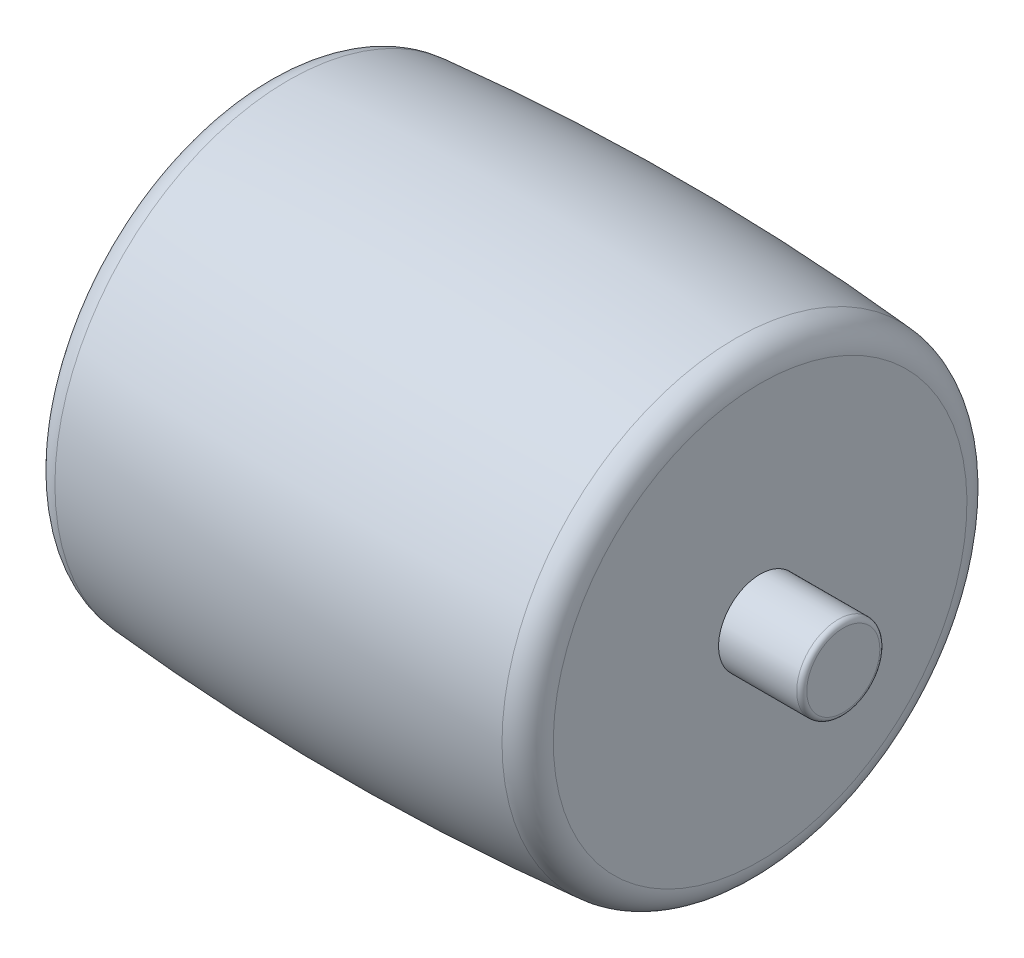
ISO-10303-21;
HEADER;
FILE_DESCRIPTION(('STEP AP214'),'2;1');
FILE_NAME('part.step','',(''),(''),'','','');
FILE_SCHEMA(('AUTOMOTIVE_DESIGN { 1 0 10303 214 1 1 1 1 }'));
ENDSEC;
DATA;
#1=APPLICATION_CONTEXT('core data for automotive mechanical design processes');
#2=APPLICATION_PROTOCOL_DEFINITION('international standard','automotive_design',2000,#1);
#3=PRODUCT_CONTEXT('',#1,'mechanical');
#4=PRODUCT('Part','Part','',(#3));
#5=PRODUCT_RELATED_PRODUCT_CATEGORY('part','',(#4));
#6=PRODUCT_DEFINITION_FORMATION('','',#4);
#7=PRODUCT_DEFINITION_CONTEXT('part definition',#1,'design');
#8=PRODUCT_DEFINITION('design','',#6,#7);
#9=PRODUCT_DEFINITION_SHAPE('','',#8);
#10=(LENGTH_UNIT() NAMED_UNIT(*) SI_UNIT(.MILLI.,.METRE.));
#11=(NAMED_UNIT(*) PLANE_ANGLE_UNIT() SI_UNIT($,.RADIAN.));
#12=(NAMED_UNIT(*) SI_UNIT($,.STERADIAN.) SOLID_ANGLE_UNIT());
#13=UNCERTAINTY_MEASURE_WITH_UNIT(LENGTH_MEASURE(1.E-05),#10,'distance_accuracy_value','');
#14=(GEOMETRIC_REPRESENTATION_CONTEXT(3) GLOBAL_UNCERTAINTY_ASSIGNED_CONTEXT((#13)) GLOBAL_UNIT_ASSIGNED_CONTEXT((#10,
#11,#12)) REPRESENTATION_CONTEXT('',''));
#15=CARTESIAN_POINT('',(0.,0.,0.));
#16=DIRECTION('',(0.,0.,1.));
#17=DIRECTION('',(1.,0.,0.));
#18=AXIS2_PLACEMENT_3D('',#15,#16,#17);
#19=CARTESIAN_POINT('',(-17.3212522416021,-0.85375137830538,0.));
#20=DIRECTION('',(1.,0.,0.));
#21=DIRECTION('',(0.,0.,-1.));
#22=AXIS2_PLACEMENT_3D('',#19,#20,#21);
#23=PLANE('',#22);
#24=CARTESIAN_POINT('',(-17.3212522416022,-0.85375137830538,0.));
#25=DIRECTION('',(1.,0.,0.));
#26=DIRECTION('',(0.,0.,1.));
#27=AXIS2_PLACEMENT_3D('',#24,#25,#26);
#28=CIRCLE('',#27,1.3843);
#29=CARTESIAN_POINT('',(-17.3212522416022,-0.85375137830538,1.3843));
#30=VERTEX_POINT('',#29);
#31=EDGE_CURVE('E140',#30,#30,#28,.T.);
#32=ORIENTED_EDGE('',*,*,#31,.F.);
#33=EDGE_LOOP('',(#32));
#34=FACE_BOUND('',#33,.T.);
#35=ADVANCED_FACE('F15',(#34),#23,.F.);
#36=CARTESIAN_POINT('',(7.77394775839785,-0.85375137830538,0.));
#37=DIRECTION('',(1.,0.,0.));
#38=DIRECTION('',(0.,0.,-1.));
#39=AXIS2_PLACEMENT_3D('',#36,#37,#38);
#40=PLANE('',#39);
#41=CARTESIAN_POINT('',(7.77394775839785,-0.85375137830538,0.));
#42=DIRECTION('',(-1.,0.,0.));
#43=DIRECTION('',(0.,0.,-1.));
#44=AXIS2_PLACEMENT_3D('',#41,#42,#43);
#45=CIRCLE('',#44,1.3843);
#46=CARTESIAN_POINT('',(7.77394775839785,-0.85375137830538,-1.3843));
#47=VERTEX_POINT('',#46);
#48=EDGE_CURVE('E111',#47,#47,#45,.T.);
#49=ORIENTED_EDGE('',*,*,#48,.F.);
#50=EDGE_LOOP('',(#49));
#51=FACE_BOUND('',#50,.T.);
#52=ADVANCED_FACE('F115',(#51),#40,.T.);
#53=CARTESIAN_POINT('',(-17.1307522416022,-0.85375137830538,0.));
#54=DIRECTION('',(-1.,0.,0.));
#55=DIRECTION('',(0.,0.,1.));
#56=AXIS2_PLACEMENT_3D('',#53,#54,#55);
#57=TOROIDAL_SURFACE('',#56,1.3843,0.1905);
#58=ORIENTED_EDGE('',*,*,#31,.T.);
#59=EDGE_LOOP('',(#58));
#60=FACE_BOUND('',#59,.T.);
#61=CARTESIAN_POINT('',(-17.1307522416022,-0.85375137830538,0.));
#62=DIRECTION('',(-1.,0.,0.));
#63=DIRECTION('',(0.,0.,1.));
#64=AXIS2_PLACEMENT_3D('',#61,#62,#63);
#65=CIRCLE('',#64,1.5748);
#66=CARTESIAN_POINT('',(-17.1307522416022,-0.85375137830538,1.5748));
#67=VERTEX_POINT('',#66);
#68=EDGE_CURVE('E158',#67,#67,#65,.F.);
#69=ORIENTED_EDGE('',*,*,#68,.F.);
#70=EDGE_LOOP('',(#69));
#71=FACE_BOUND('',#70,.T.);
#72=ADVANCED_FACE('F95',(#60,#71),#57,.T.);
#73=CARTESIAN_POINT('',(7.58344775839785,-0.85375137830538,0.));
#74=DIRECTION('',(1.,0.,0.));
#75=DIRECTION('',(0.,0.,-1.));
#76=AXIS2_PLACEMENT_3D('',#73,#74,#75);
#77=TOROIDAL_SURFACE('',#76,1.3843,0.1905);
#78=ORIENTED_EDGE('',*,*,#48,.T.);
#79=EDGE_LOOP('',(#78));
#80=FACE_BOUND('',#79,.T.);
#81=CARTESIAN_POINT('',(7.58344775839785,-0.85375137830538,0.));
#82=DIRECTION('',(1.,0.,0.));
#83=DIRECTION('',(0.,0.,-1.));
#84=AXIS2_PLACEMENT_3D('',#81,#82,#83);
#85=CIRCLE('',#84,1.5748);
#86=CARTESIAN_POINT('',(7.58344775839785,-0.85375137830538,-1.5748));
#87=VERTEX_POINT('',#86);
#88=EDGE_CURVE('E155',#87,#87,#85,.F.);
#89=ORIENTED_EDGE('',*,*,#88,.F.);
#90=EDGE_LOOP('',(#89));
#91=FACE_BOUND('',#90,.T.);
#92=ADVANCED_FACE('F89',(#80,#91),#77,.T.);
#93=CARTESIAN_POINT('',(-14.1716522416022,-0.85375137830538,0.));
#94=DIRECTION('',(-1.,0.,0.));
#95=DIRECTION('',(0.,0.,1.));
#96=AXIS2_PLACEMENT_3D('',#93,#94,#95);
#97=CYLINDRICAL_SURFACE('',#96,1.5748);
#98=ORIENTED_EDGE('',*,*,#68,.T.);
#99=EDGE_LOOP('',(#98));
#100=FACE_BOUND('',#99,.T.);
#101=CARTESIAN_POINT('',(-14.1716522416022,-0.85375137830538,0.));
#102=DIRECTION('',(-1.,0.,0.));
#103=DIRECTION('',(0.,0.,1.));
#104=AXIS2_PLACEMENT_3D('',#101,#102,#103);
#105=CIRCLE('',#104,1.5748);
#106=CARTESIAN_POINT('',(-14.1716522416022,-0.85375137830538,1.5748));
#107=VERTEX_POINT('',#106);
#108=EDGE_CURVE('E152',#107,#107,#105,.F.);
#109=ORIENTED_EDGE('',*,*,#108,.F.);
#110=EDGE_LOOP('',(#109));
#111=FACE_BOUND('',#110,.T.);
#112=ADVANCED_FACE('F85',(#100,#111),#97,.T.);
#113=CARTESIAN_POINT('',(4.62434775839785,-0.85375137830538,0.));
#114=DIRECTION('',(1.,0.,0.));
#115=DIRECTION('',(0.,0.,-1.));
#116=AXIS2_PLACEMENT_3D('',#113,#114,#115);
#117=CYLINDRICAL_SURFACE('',#116,1.5748);
#118=ORIENTED_EDGE('',*,*,#88,.T.);
#119=EDGE_LOOP('',(#118));
#120=FACE_BOUND('',#119,.T.);
#121=CARTESIAN_POINT('',(4.62434775839785,-0.85375137830538,0.));
#122=DIRECTION('',(1.,0.,0.));
#123=DIRECTION('',(0.,0.,-1.));
#124=AXIS2_PLACEMENT_3D('',#121,#122,#123);
#125=CIRCLE('',#124,1.5748);
#126=CARTESIAN_POINT('',(4.62434775839785,-0.85375137830538,-1.5748));
#127=VERTEX_POINT('',#126);
#128=EDGE_CURVE('E144',#127,#127,#125,.F.);
#129=ORIENTED_EDGE('',*,*,#128,.F.);
#130=EDGE_LOOP('',(#129));
#131=FACE_BOUND('',#130,.T.);
#132=ADVANCED_FACE('F80',(#120,#131),#117,.T.);
#133=CARTESIAN_POINT('',(-14.1716522416022,7.90924862169461,0.));
#134=DIRECTION('',(-1.,0.,0.));
#135=DIRECTION('',(0.,0.,1.));
#136=AXIS2_PLACEMENT_3D('',#133,#134,#135);
#137=PLANE('',#136);
#138=ORIENTED_EDGE('',*,*,#108,.T.);
#139=EDGE_LOOP('',(#138));
#140=FACE_BOUND('',#139,.T.);
#141=CARTESIAN_POINT('',(-14.1716522416022,-0.85375137830538,0.));
#142=DIRECTION('',(1.,0.,0.));
#143=DIRECTION('',(0.,1.,0.));
#144=AXIS2_PLACEMENT_3D('',#141,#142,#143);
#145=CIRCLE('',#144,7.83273280726134);
#146=CARTESIAN_POINT('',(-14.1716522416022,6.97898142895596,0.));
#147=VERTEX_POINT('',#146);
#148=EDGE_CURVE('E64',#147,#147,#145,.T.);
#149=ORIENTED_EDGE('',*,*,#148,.F.);
#150=EDGE_LOOP('',(#149));
#151=FACE_BOUND('',#150,.T.);
#152=ADVANCED_FACE('F70',(#140,#151),#137,.T.);
#153=CARTESIAN_POINT('',(4.62434775839785,-0.85375137830538,0.));
#154=DIRECTION('',(1.,0.,0.));
#155=DIRECTION('',(0.,0.,-1.));
#156=AXIS2_PLACEMENT_3D('',#153,#154,#155);
#157=PLANE('',#156);
#158=ORIENTED_EDGE('',*,*,#128,.T.);
#159=EDGE_LOOP('',(#158));
#160=FACE_BOUND('',#159,.T.);
#161=CARTESIAN_POINT('',(4.62434775839785,-0.85375137830538,0.));
#162=DIRECTION('',(-1.,0.,0.));
#163=DIRECTION('',(0.,1.,0.));
#164=AXIS2_PLACEMENT_3D('',#161,#162,#163);
#165=CIRCLE('',#164,7.83273280726134);
#166=CARTESIAN_POINT('',(4.62434775839785,6.97898142895596,0.));
#167=VERTEX_POINT('',#166);
#168=EDGE_CURVE('E28',#167,#167,#165,.T.);
#169=ORIENTED_EDGE('',*,*,#168,.F.);
#170=EDGE_LOOP('',(#169));
#171=FACE_BOUND('',#170,.T.);
#172=ADVANCED_FACE('F79',(#160,#171),#157,.T.);
#173=CARTESIAN_POINT('',(-13.1556522416022,-0.85375137830538,0.));
#174=DIRECTION('',(1.,0.,0.));
#175=DIRECTION('',(0.,0.,-1.));
#176=AXIS2_PLACEMENT_3D('',#173,#174,#175);
#177=TOROIDAL_SURFACE('',#176,7.83273280726132,1.016);
#178=CARTESIAN_POINT('',(-13.2403189082688,-0.85375137830538,0.));
#179=DIRECTION('',(-1.,0.,0.));
#180=DIRECTION('',(0.,0.,1.));
#181=AXIS2_PLACEMENT_3D('',#178,#179,#180);
#182=CIRCLE('',#181,8.84519888351057);
#183=CARTESIAN_POINT('',(-13.2403189082688,-0.85375137830538,8.84519888351057));
#184=VERTEX_POINT('',#183);
#185=EDGE_CURVE('E23',#184,#184,#182,.T.);
#186=ORIENTED_EDGE('',*,*,#185,.T.);
#187=EDGE_LOOP('',(#186));
#188=FACE_BOUND('',#187,.T.);
#189=ORIENTED_EDGE('',*,*,#148,.T.);
#190=EDGE_LOOP('',(#189));
#191=FACE_BOUND('',#190,.T.);
#192=ADVANCED_FACE('F44',(#188,#191),#177,.T.);
#193=CARTESIAN_POINT('',(3.60834775839785,-0.85375137830538,0.));
#194=DIRECTION('',(1.,0.,0.));
#195=DIRECTION('',(0.,0.,-1.));
#196=AXIS2_PLACEMENT_3D('',#193,#194,#195);
#197=TOROIDAL_SURFACE('',#196,7.83273280726132,1.016);
#198=ORIENTED_EDGE('',*,*,#168,.T.);
#199=EDGE_LOOP('',(#198));
#200=FACE_BOUND('',#199,.T.);
#201=CARTESIAN_POINT('',(3.69301442506451,-0.85375137830538,0.));
#202=DIRECTION('',(1.,0.,0.));
#203=DIRECTION('',(0.,0.,1.));
#204=AXIS2_PLACEMENT_3D('',#201,#202,#203);
#205=CIRCLE('',#204,8.84519888351057);
#206=CARTESIAN_POINT('',(3.69301442506451,-0.85375137830538,8.84519888351057));
#207=VERTEX_POINT('',#206);
#208=EDGE_CURVE('E10',#207,#207,#205,.T.);
#209=ORIENTED_EDGE('',*,*,#208,.T.);
#210=EDGE_LOOP('',(#209));
#211=FACE_BOUND('',#210,.T.);
#212=ADVANCED_FACE('F40',(#200,#211),#197,.T.);
#213=CARTESIAN_POINT('',(-4.77365224160215,-0.85375137830538,0.));
#214=DIRECTION('',(1.,0.,0.));
#215=DIRECTION('',(0.,0.,-1.));
#216=AXIS2_PLACEMENT_3D('',#213,#214,#215);
#217=DEGENERATE_TOROIDAL_SURFACE('',#216,92.4014087414144,101.6,.F.);
#218=ORIENTED_EDGE('',*,*,#185,.F.);
#219=EDGE_LOOP('',(#218));
#220=FACE_BOUND('',#219,.T.);
#221=ORIENTED_EDGE('',*,*,#208,.F.);
#222=EDGE_LOOP('',(#221));
#223=FACE_BOUND('',#222,.T.);
#224=ADVANCED_FACE('F17',(#220,#223),#217,.F.);
#225=CLOSED_SHELL('',(#35,#52,#72,#92,#112,#132,#152,#172,#192,#212,#224));
#226=MANIFOLD_SOLID_BREP('B1',#225);
#227=ADVANCED_BREP_SHAPE_REPRESENTATION('',(#18,#226),#14);
#228=SHAPE_DEFINITION_REPRESENTATION(#9,#227);
ENDSEC;
END-ISO-10303-21;
